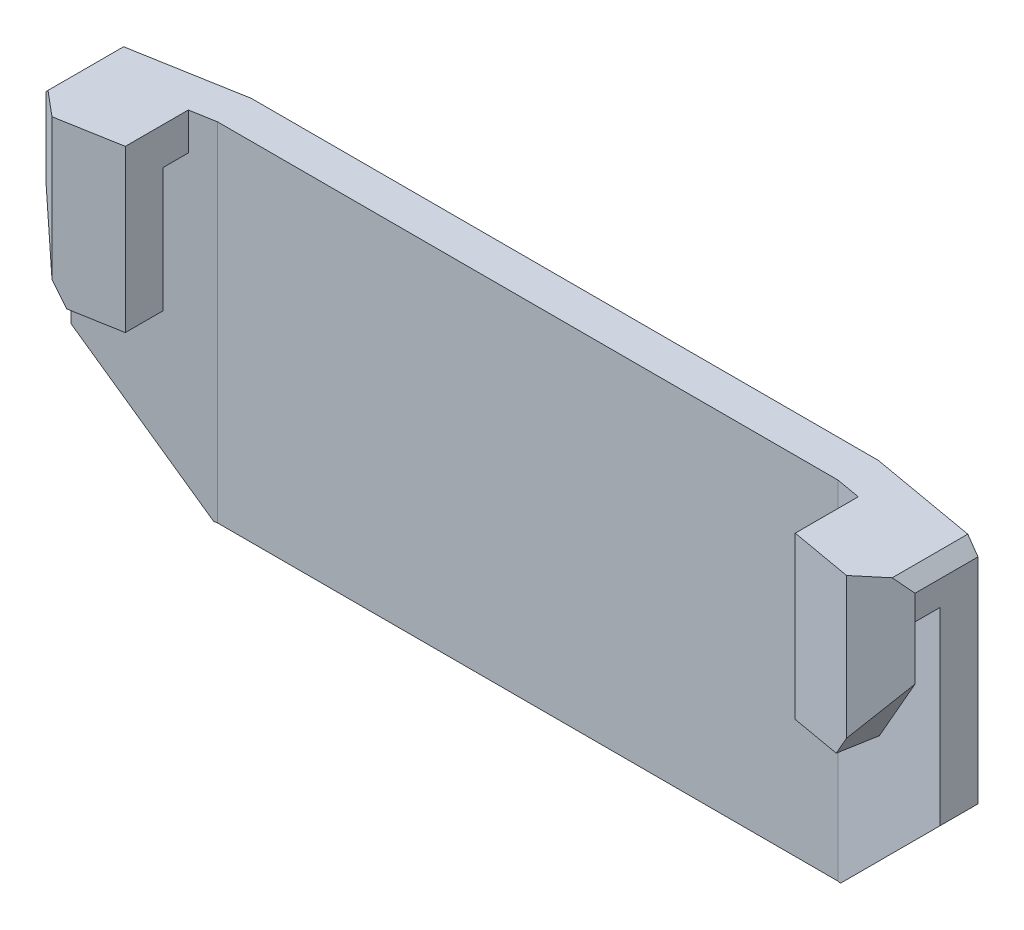
ISO-10303-21;
HEADER;
FILE_DESCRIPTION(('STEP AP214'),'2;1');
FILE_NAME('part.step','',(''),(''),'','','');
FILE_SCHEMA(('AUTOMOTIVE_DESIGN { 1 0 10303 214 1 1 1 1 }'));
ENDSEC;
DATA;
#1=APPLICATION_CONTEXT('core data for automotive mechanical design processes');
#2=APPLICATION_PROTOCOL_DEFINITION('international standard','automotive_design',2000,#1);
#3=PRODUCT_CONTEXT('',#1,'mechanical');
#4=PRODUCT('Part','Part','',(#3));
#5=PRODUCT_RELATED_PRODUCT_CATEGORY('part','',(#4));
#6=PRODUCT_DEFINITION_FORMATION('','',#4);
#7=PRODUCT_DEFINITION_CONTEXT('part definition',#1,'design');
#8=PRODUCT_DEFINITION('design','',#6,#7);
#9=PRODUCT_DEFINITION_SHAPE('','',#8);
#10=(LENGTH_UNIT() NAMED_UNIT(*) SI_UNIT(.MILLI.,.METRE.));
#11=(NAMED_UNIT(*) PLANE_ANGLE_UNIT() SI_UNIT($,.RADIAN.));
#12=(NAMED_UNIT(*) SI_UNIT($,.STERADIAN.) SOLID_ANGLE_UNIT());
#13=UNCERTAINTY_MEASURE_WITH_UNIT(LENGTH_MEASURE(1.E-05),#10,'distance_accuracy_value','');
#14=(GEOMETRIC_REPRESENTATION_CONTEXT(3) GLOBAL_UNCERTAINTY_ASSIGNED_CONTEXT((#13)) GLOBAL_UNIT_ASSIGNED_CONTEXT((#10,
#11,#12)) REPRESENTATION_CONTEXT('',''));
#15=CARTESIAN_POINT('',(0.,0.,0.));
#16=DIRECTION('',(0.,0.,1.));
#17=DIRECTION('',(1.,0.,0.));
#18=AXIS2_PLACEMENT_3D('',#15,#16,#17);
#19=CARTESIAN_POINT('',(0.,0.,0.));
#20=DIRECTION('',(0.,1.,0.));
#21=DIRECTION('',(0.,0.,1.));
#22=AXIS2_PLACEMENT_3D('',#19,#20,#21);
#23=PLANE('',#22);
#24=DIRECTION('',(0.,0.,-1.));
#25=VECTOR('',#24,1.);
#26=CARTESIAN_POINT('',(-26.9999999999979,0.,6.41436040896905));
#27=LINE('',#26,#25);
#28=CARTESIAN_POINT('',(-26.9999999999979,0.,4.38350718519735));
#29=VERTEX_POINT('',#28);
#30=CARTESIAN_POINT('',(-26.9999999999979,0.,2.35265396142685));
#31=VERTEX_POINT('',#30);
#32=EDGE_CURVE('E306',#29,#31,#27,.T.);
#33=ORIENTED_EDGE('',*,*,#32,.F.);
#34=DIRECTION('',(-0.984807753012105,0.,0.173648177667513));
#35=VECTOR('',#34,1.);
#36=CARTESIAN_POINT('',(-0.0645257415180483,0.,-0.365943664767394));
#37=LINE('',#36,#35);
#38=CARTESIAN_POINT('',(-35.0230548571713,0.,5.79818822422603));
#39=VERTEX_POINT('',#38);
#40=EDGE_CURVE('E240',#29,#39,#37,.T.);
#41=ORIENTED_EDGE('',*,*,#40,.T.);
#42=DIRECTION('',(0.,0.,1.));
#43=VECTOR('',#42,1.);
#44=CARTESIAN_POINT('',(-35.0230548571713,0.,1.73648177667474));
#45=LINE('',#44,#43);
#46=CARTESIAN_POINT('',(-35.0230548571713,0.,3.76733500045553));
#47=VERTEX_POINT('',#46);
#48=EDGE_CURVE('E302',#47,#39,#45,.T.);
#49=ORIENTED_EDGE('',*,*,#48,.F.);
#50=DIRECTION('',(-0.984807753012105,0.,0.173648177667513));
#51=VECTOR('',#50,1.);
#52=CARTESIAN_POINT('',(-26.9999999999979,0.,2.35265396142685));
#53=LINE('',#52,#51);
#54=EDGE_CURVE('E269',#31,#47,#53,.T.);
#55=ORIENTED_EDGE('',*,*,#54,.F.);
#56=EDGE_LOOP('',(#33,#41,#49,#55));
#57=FACE_BOUND('',#56,.T.);
#58=ADVANCED_FACE('F46',(#57),#23,.F.);
#59=DIRECTION('',(0.,0.,-1.));
#60=VECTOR('',#59,1.);
#61=CARTESIAN_POINT('',(35.0230548571713,0.,1.73648177667474));
#62=LINE('',#61,#60);
#63=CARTESIAN_POINT('',(35.0230548571714,0.,5.79818822422579));
#64=VERTEX_POINT('',#63);
#65=CARTESIAN_POINT('',(35.0230548571713,0.,3.76733500045552));
#66=VERTEX_POINT('',#65);
#67=EDGE_CURVE('E280',#64,#66,#62,.T.);
#68=ORIENTED_EDGE('',*,*,#67,.F.);
#69=DIRECTION('',(-0.984807753012107,0.,-0.173648177667506));
#70=VECTOR('',#69,1.);
#71=CARTESIAN_POINT('',(0.0645257415180458,0.,-0.365943664767394));
#72=LINE('',#71,#70);
#73=CARTESIAN_POINT('',(26.9999999999979,0.,4.38350718519716));
#74=VERTEX_POINT('',#73);
#75=EDGE_CURVE('E478',#64,#74,#72,.T.);
#76=ORIENTED_EDGE('',*,*,#75,.T.);
#77=DIRECTION('',(0.,0.,1.));
#78=VECTOR('',#77,1.);
#79=CARTESIAN_POINT('',(26.9999999999979,0.,6.41436040896905));
#80=LINE('',#79,#78);
#81=CARTESIAN_POINT('',(26.9999999999979,0.,2.35265396142685));
#82=VERTEX_POINT('',#81);
#83=EDGE_CURVE('E285',#82,#74,#80,.T.);
#84=ORIENTED_EDGE('',*,*,#83,.F.);
#85=DIRECTION('',(-0.984807753012106,0.,-0.173648177667512));
#86=VECTOR('',#85,1.);
#87=CARTESIAN_POINT('',(24.9999999999987,0.,2.00000000000886));
#88=LINE('',#87,#86);
#89=EDGE_CURVE('E254',#66,#82,#88,.T.);
#90=ORIENTED_EDGE('',*,*,#89,.F.);
#91=EDGE_LOOP('',(#68,#76,#84,#90));
#92=FACE_BOUND('',#91,.T.);
#93=ADVANCED_FACE('F544',(#92),#23,.F.);
#94=CARTESIAN_POINT('',(35.0230548571713,3.,1.73648177667474));
#95=DIRECTION('',(-1.,0.,0.));
#96=DIRECTION('',(0.,0.,1.));
#97=AXIS2_PLACEMENT_3D('',#94,#95,#96);
#98=PLANE('',#97);
#99=DIRECTION('',(0.,1.,0.));
#100=VECTOR('',#99,1.);
#101=CARTESIAN_POINT('',(35.0230548571713,-95.0995422141101,0.721055164788883));
#102=LINE('',#101,#100);
#103=CARTESIAN_POINT('',(35.0230548571713,-15.2394111334073,0.721055164788883));
#104=VERTEX_POINT('',#103);
#105=CARTESIAN_POINT('',(35.0230548571713,1.99999999999997,0.721055164788883));
#106=VERTEX_POINT('',#105);
#107=EDGE_CURVE('E369',#104,#106,#102,.T.);
#108=ORIENTED_EDGE('',*,*,#107,.T.);
#109=DIRECTION('',(0.,0.,1.));
#110=VECTOR('',#109,1.);
#111=CARTESIAN_POINT('',(35.0230548571713,1.99999999999998,5.79818822422579));
#112=LINE('',#111,#110);
#113=CARTESIAN_POINT('',(35.0230548571714,1.99999999999998,5.79818822422579));
#114=VERTEX_POINT('',#113);
#115=EDGE_CURVE('E56',#106,#114,#112,.T.);
#116=ORIENTED_EDGE('',*,*,#115,.T.);
#117=DIRECTION('',(0.,-1.,0.));
#118=VECTOR('',#117,1.);
#119=CARTESIAN_POINT('',(35.0230548571714,7.27549071302264,5.79818822422579));
#120=LINE('',#119,#118);
#121=EDGE_CURVE('E387',#114,#64,#120,.T.);
#122=ORIENTED_EDGE('',*,*,#121,.T.);
#123=ORIENTED_EDGE('',*,*,#67,.T.);
#124=DIRECTION('',(0.,1.,0.));
#125=VECTOR('',#124,1.);
#126=CARTESIAN_POINT('',(35.0230548571713,-25.,3.76733500045552));
#127=LINE('',#126,#125);
#128=CARTESIAN_POINT('',(35.0230548571713,-15.2394111334073,3.76733500045552));
#129=VERTEX_POINT('',#128);
#130=EDGE_CURVE('E277',#129,#66,#127,.T.);
#131=ORIENTED_EDGE('',*,*,#130,.F.);
#132=DIRECTION('',(0.,0.,-1.));
#133=VECTOR('',#132,1.);
#134=CARTESIAN_POINT('',(35.0230548571713,-15.2394111334073,3.76733500045552));
#135=LINE('',#134,#133);
#136=EDGE_CURVE('E416',#129,#104,#135,.T.);
#137=ORIENTED_EDGE('',*,*,#136,.T.);
#138=EDGE_LOOP('',(#108,#116,#122,#123,#131,#137));
#139=FACE_BOUND('',#138,.T.);
#140=ADVANCED_FACE('F547',(#139),#98,.F.);
#141=CARTESIAN_POINT('',(-35.0230548571713,3.,1.73648177667474));
#142=DIRECTION('',(1.,0.,0.));
#143=DIRECTION('',(0.,0.,-1.));
#144=AXIS2_PLACEMENT_3D('',#141,#142,#143);
#145=PLANE('',#144);
#146=DIRECTION('',(0.,-1.,0.));
#147=VECTOR('',#146,1.);
#148=CARTESIAN_POINT('',(-35.0230548571713,7.27549071302266,5.79818822422603));
#149=LINE('',#148,#147);
#150=CARTESIAN_POINT('',(-35.0230548571713,1.99999999999998,5.79818822422603));
#151=VERTEX_POINT('',#150);
#152=EDGE_CURVE('E230',#151,#39,#149,.T.);
#153=ORIENTED_EDGE('',*,*,#152,.F.);
#154=DIRECTION('',(0.,0.,-1.));
#155=VECTOR('',#154,1.);
#156=CARTESIAN_POINT('',(-35.0230548571713,1.99999999999998,0.721055164788891));
#157=LINE('',#156,#155);
#158=CARTESIAN_POINT('',(-35.0230548571713,1.99999999999997,0.721055164788891));
#159=VERTEX_POINT('',#158);
#160=EDGE_CURVE('E345',#151,#159,#157,.T.);
#161=ORIENTED_EDGE('',*,*,#160,.T.);
#162=DIRECTION('',(0.,1.,0.));
#163=VECTOR('',#162,1.);
#164=CARTESIAN_POINT('',(-35.0230548571713,-95.0995422141101,0.721055164788891));
#165=LINE('',#164,#163);
#166=CARTESIAN_POINT('',(-35.0230548571713,-15.2394111334074,0.721055164788891));
#167=VERTEX_POINT('',#166);
#168=EDGE_CURVE('E362',#167,#159,#165,.T.);
#169=ORIENTED_EDGE('',*,*,#168,.F.);
#170=DIRECTION('',(0.,0.,-1.));
#171=VECTOR('',#170,1.);
#172=CARTESIAN_POINT('',(-35.0230548571713,-15.2394111334074,3.76733500045552));
#173=LINE('',#172,#171);
#174=CARTESIAN_POINT('',(-35.0230548571713,-15.2394111334074,3.76733500045552));
#175=VERTEX_POINT('',#174);
#176=EDGE_CURVE('E420',#175,#167,#173,.T.);
#177=ORIENTED_EDGE('',*,*,#176,.F.);
#178=DIRECTION('',(0.,1.,0.));
#179=VECTOR('',#178,1.);
#180=CARTESIAN_POINT('',(-35.0230548571713,-25.,3.76733500045553));
#181=LINE('',#180,#179);
#182=EDGE_CURVE('E266',#175,#47,#181,.T.);
#183=ORIENTED_EDGE('',*,*,#182,.T.);
#184=ORIENTED_EDGE('',*,*,#48,.T.);
#185=EDGE_LOOP('',(#153,#161,#169,#177,#183,#184));
#186=FACE_BOUND('',#185,.T.);
#187=ADVANCED_FACE('F374',(#186),#145,.F.);
#188=CARTESIAN_POINT('',(-26.9999999999979,3.,6.41436040896905));
#189=DIRECTION('',(-1.,0.,0.));
#190=DIRECTION('',(0.,0.,1.));
#191=AXIS2_PLACEMENT_3D('',#188,#189,#190);
#192=PLANE('',#191);
#193=DIRECTION('',(0.,-1.,0.));
#194=VECTOR('',#193,1.);
#195=CARTESIAN_POINT('',(-26.9999999999979,12.1798464674904,4.38350718519735));
#196=LINE('',#195,#194);
#197=CARTESIAN_POINT('',(-26.9999999999979,-10.,4.38350718519735));
#198=VERTEX_POINT('',#197);
#199=EDGE_CURVE('E242',#29,#198,#196,.T.);
#200=ORIENTED_EDGE('',*,*,#199,.F.);
#201=ORIENTED_EDGE('',*,*,#32,.T.);
#202=DIRECTION('',(0.,-1.,0.));
#203=VECTOR('',#202,1.);
#204=CARTESIAN_POINT('',(-26.9999999999979,3.,2.35265396142685));
#205=LINE('',#204,#203);
#206=CARTESIAN_POINT('',(-26.9999999999979,3.,2.35265396142685));
#207=VERTEX_POINT('',#206);
#208=EDGE_CURVE('E274',#207,#31,#205,.T.);
#209=ORIENTED_EDGE('',*,*,#208,.F.);
#210=DIRECTION('',(0.,0.,-1.));
#211=VECTOR('',#210,1.);
#212=CARTESIAN_POINT('',(-26.9999999999979,3.,6.41436040896905));
#213=LINE('',#212,#211);
#214=CARTESIAN_POINT('',(-26.9999999999979,3.,7.4297870208549));
#215=VERTEX_POINT('',#214);
#216=EDGE_CURVE('E281',#215,#207,#213,.T.);
#217=ORIENTED_EDGE('',*,*,#216,.F.);
#218=DIRECTION('',(0.,-1.,0.));
#219=VECTOR('',#218,1.);
#220=CARTESIAN_POINT('',(-26.9999999999979,12.1798464674904,7.4297870208549));
#221=LINE('',#220,#219);
#222=CARTESIAN_POINT('',(-26.9999999999979,-10.,7.4297870208549));
#223=VERTEX_POINT('',#222);
#224=EDGE_CURVE('E234',#215,#223,#221,.T.);
#225=ORIENTED_EDGE('',*,*,#224,.T.);
#226=DIRECTION('',(0.,0.,1.));
#227=VECTOR('',#226,1.);
#228=CARTESIAN_POINT('',(-26.9999999999979,-10.,4.38350718519735));
#229=LINE('',#228,#227);
#230=EDGE_CURVE('E483',#198,#223,#229,.T.);
#231=ORIENTED_EDGE('',*,*,#230,.F.);
#232=EDGE_LOOP('',(#200,#201,#209,#217,#225,#231));
#233=FACE_BOUND('',#232,.T.);
#234=ADVANCED_FACE('F500',(#233),#192,.F.);
#235=CARTESIAN_POINT('',(-26.9999999999979,3.,2.35265396142685));
#236=DIRECTION('',(-0.173648177667513,0.,-0.984807753012105));
#237=DIRECTION('',(-0.984807753012105,0.,0.173648177667513));
#238=AXIS2_PLACEMENT_3D('',#235,#236,#237);
#239=PLANE('',#238);
#240=ORIENTED_EDGE('',*,*,#182,.F.);
#241=DIRECTION('',(0.701673843159825,-0.701673843159828,-0.123724030206905));
#242=VECTOR('',#241,1.);
#243=CARTESIAN_POINT('',(-39.9302248649527,-10.332241125626,4.63260147175375));
#244=LINE('',#243,#242);
#245=CARTESIAN_POINT('',(-25.2624659905788,-25.,2.04627983566665));
#246=VERTEX_POINT('',#245);
#247=EDGE_CURVE('E415',#175,#246,#244,.T.);
#248=ORIENTED_EDGE('',*,*,#247,.T.);
#249=DIRECTION('',(-0.984807753012105,0.,0.173648177667513));
#250=VECTOR('',#249,1.);
#251=CARTESIAN_POINT('',(-24.9999999999987,-25.,2.00000000000885));
#252=LINE('',#251,#250);
#253=CARTESIAN_POINT('',(-24.9999999999987,-25.,2.00000000000885));
#254=VERTEX_POINT('',#253);
#255=EDGE_CURVE('E262',#254,#246,#252,.T.);
#256=ORIENTED_EDGE('',*,*,#255,.F.);
#257=DIRECTION('',(0.,-1.,0.));
#258=VECTOR('',#257,1.);
#259=CARTESIAN_POINT('',(-24.9999999999987,3.,2.00000000000885));
#260=LINE('',#259,#258);
#261=CARTESIAN_POINT('',(-24.9999999999987,3.,2.00000000000885));
#262=VERTEX_POINT('',#261);
#263=EDGE_CURVE('E319',#262,#254,#260,.T.);
#264=ORIENTED_EDGE('',*,*,#263,.F.);
#265=DIRECTION('',(0.984807753012105,0.,-0.173648177667513));
#266=VECTOR('',#265,1.);
#267=CARTESIAN_POINT('',(-26.9999999999979,3.,2.35265396142685));
#268=LINE('',#267,#266);
#269=EDGE_CURVE('E284',#207,#262,#268,.T.);
#270=ORIENTED_EDGE('',*,*,#269,.F.);
#271=ORIENTED_EDGE('',*,*,#208,.T.);
#272=ORIENTED_EDGE('',*,*,#54,.T.);
#273=EDGE_LOOP('',(#240,#248,#256,#264,#270,#271,#272));
#274=FACE_BOUND('',#273,.T.);
#275=ADVANCED_FACE('F509',(#274),#239,.F.);
#276=CARTESIAN_POINT('',(-24.9999999999987,3.,2.00000000000885));
#277=DIRECTION('',(0.,0.,-1.));
#278=DIRECTION('',(-1.,0.,0.));
#279=AXIS2_PLACEMENT_3D('',#276,#277,#278);
#280=PLANE('',#279);
#281=ORIENTED_EDGE('',*,*,#263,.T.);
#282=DIRECTION('',(-1.,0.,0.));
#283=VECTOR('',#282,1.);
#284=CARTESIAN_POINT('',(-24.9999999999987,-25.,2.00000000000885));
#285=LINE('',#284,#283);
#286=CARTESIAN_POINT('',(24.9999999999987,-25.,2.00000000000886));
#287=VERTEX_POINT('',#286);
#288=EDGE_CURVE('E258',#287,#254,#285,.T.);
#289=ORIENTED_EDGE('',*,*,#288,.F.);
#290=DIRECTION('',(0.,-1.,0.));
#291=VECTOR('',#290,1.);
#292=CARTESIAN_POINT('',(24.9999999999987,3.,2.00000000000886));
#293=LINE('',#292,#291);
#294=CARTESIAN_POINT('',(24.9999999999987,3.,2.00000000000886));
#295=VERTEX_POINT('',#294);
#296=EDGE_CURVE('E315',#295,#287,#293,.T.);
#297=ORIENTED_EDGE('',*,*,#296,.F.);
#298=DIRECTION('',(1.,0.,0.));
#299=VECTOR('',#298,1.);
#300=CARTESIAN_POINT('',(-24.9999999999987,3.,2.00000000000885));
#301=LINE('',#300,#299);
#302=EDGE_CURVE('E288',#262,#295,#301,.T.);
#303=ORIENTED_EDGE('',*,*,#302,.F.);
#304=EDGE_LOOP('',(#281,#289,#297,#303));
#305=FACE_BOUND('',#304,.T.);
#306=ADVANCED_FACE('F512',(#305),#280,.F.);
#307=CARTESIAN_POINT('',(26.9999999999979,3.,2.35265396142685));
#308=DIRECTION('',(0.173648177667512,0.,-0.984807753012105));
#309=DIRECTION('',(-0.984807753012106,0.,-0.173648177667512));
#310=AXIS2_PLACEMENT_3D('',#307,#308,#309);
#311=PLANE('',#310);
#312=DIRECTION('',(-0.984807753012105,0.,-0.173648177667512));
#313=VECTOR('',#312,1.);
#314=CARTESIAN_POINT('',(26.9999999999979,-25.,2.35265396142685));
#315=LINE('',#314,#313);
#316=CARTESIAN_POINT('',(25.2624659905787,-25.,2.04627983566664));
#317=VERTEX_POINT('',#316);
#318=EDGE_CURVE('E255',#317,#287,#315,.T.);
#319=ORIENTED_EDGE('',*,*,#318,.F.);
#320=DIRECTION('',(0.701673843159825,0.701673843159827,0.123724030206904));
#321=VECTOR('',#320,1.);
#322=CARTESIAN_POINT('',(39.9302248649527,-10.3322411256259,4.63260147175374));
#323=LINE('',#322,#321);
#324=EDGE_CURVE('E429',#317,#129,#323,.T.);
#325=ORIENTED_EDGE('',*,*,#324,.T.);
#326=ORIENTED_EDGE('',*,*,#130,.T.);
#327=ORIENTED_EDGE('',*,*,#89,.T.);
#328=DIRECTION('',(0.,-1.,0.));
#329=VECTOR('',#328,1.);
#330=CARTESIAN_POINT('',(26.9999999999979,3.,2.35265396142685));
#331=LINE('',#330,#329);
#332=CARTESIAN_POINT('',(26.9999999999979,3.,2.35265396142685));
#333=VERTEX_POINT('',#332);
#334=EDGE_CURVE('E298',#333,#82,#331,.T.);
#335=ORIENTED_EDGE('',*,*,#334,.F.);
#336=DIRECTION('',(0.984807753012106,0.,0.173648177667512));
#337=VECTOR('',#336,1.);
#338=CARTESIAN_POINT('',(26.9999999999979,3.,2.35265396142685));
#339=LINE('',#338,#337);
#340=EDGE_CURVE('E291',#295,#333,#339,.T.);
#341=ORIENTED_EDGE('',*,*,#340,.F.);
#342=ORIENTED_EDGE('',*,*,#296,.T.);
#343=EDGE_LOOP('',(#319,#325,#326,#327,#335,#341,#342));
#344=FACE_BOUND('',#343,.T.);
#345=ADVANCED_FACE('F517',(#344),#311,.F.);
#346=CARTESIAN_POINT('',(26.9999999999979,3.,6.41436040896905));
#347=DIRECTION('',(1.,0.,0.));
#348=DIRECTION('',(0.,0.,-1.));
#349=AXIS2_PLACEMENT_3D('',#346,#347,#348);
#350=PLANE('',#349);
#351=ORIENTED_EDGE('',*,*,#83,.T.);
#352=DIRECTION('',(0.,-1.,0.));
#353=VECTOR('',#352,1.);
#354=CARTESIAN_POINT('',(26.9999999999979,12.1798464674904,4.38350718519716));
#355=LINE('',#354,#353);
#356=CARTESIAN_POINT('',(26.9999999999979,-10.,4.38350718519716));
#357=VERTEX_POINT('',#356);
#358=EDGE_CURVE('E446',#74,#357,#355,.T.);
#359=ORIENTED_EDGE('',*,*,#358,.T.);
#360=DIRECTION('',(0.,0.,-1.));
#361=VECTOR('',#360,1.);
#362=CARTESIAN_POINT('',(26.9999999999979,-10.,4.38350718519716));
#363=LINE('',#362,#361);
#364=CARTESIAN_POINT('',(26.9999999999979,-10.,7.42978702085472));
#365=VERTEX_POINT('',#364);
#366=EDGE_CURVE('E474',#365,#357,#363,.T.);
#367=ORIENTED_EDGE('',*,*,#366,.F.);
#368=DIRECTION('',(0.,-1.,0.));
#369=VECTOR('',#368,1.);
#370=CARTESIAN_POINT('',(26.9999999999979,12.1798464674904,7.42978702085472));
#371=LINE('',#370,#369);
#372=CARTESIAN_POINT('',(26.9999999999979,3.,7.42978702085472));
#373=VERTEX_POINT('',#372);
#374=EDGE_CURVE('E456',#373,#365,#371,.T.);
#375=ORIENTED_EDGE('',*,*,#374,.F.);
#376=DIRECTION('',(0.,0.,1.));
#377=VECTOR('',#376,1.);
#378=CARTESIAN_POINT('',(26.9999999999979,3.,6.41436040896905));
#379=LINE('',#378,#377);
#380=EDGE_CURVE('E294',#333,#373,#379,.T.);
#381=ORIENTED_EDGE('',*,*,#380,.F.);
#382=ORIENTED_EDGE('',*,*,#334,.T.);
#383=EDGE_LOOP('',(#351,#359,#367,#375,#381,#382));
#384=FACE_BOUND('',#383,.T.);
#385=ADVANCED_FACE('F523',(#384),#350,.F.);
#386=CARTESIAN_POINT('',(0.,3.,0.));
#387=DIRECTION('',(0.,1.,0.));
#388=DIRECTION('',(0.,0.,1.));
#389=AXIS2_PLACEMENT_3D('',#386,#387,#388);
#390=PLANE('',#389);
#391=DIRECTION('',(-0.984807753012105,0.,0.173648177667513));
#392=VECTOR('',#391,1.);
#393=CARTESIAN_POINT('',(-35.0230548571713,3.,0.721055164788891));
#394=LINE('',#393,#392);
#395=CARTESIAN_POINT('',(-25.2624659905788,3.,-0.999999999999994));
#396=VERTEX_POINT('',#395);
#397=CARTESIAN_POINT('',(-34.0230548571713,3.,0.544728184079813));
#398=VERTEX_POINT('',#397);
#399=EDGE_CURVE('E359',#396,#398,#394,.T.);
#400=ORIENTED_EDGE('',*,*,#399,.T.);
#401=DIRECTION('',(0.,0.,1.));
#402=VECTOR('',#401,1.);
#403=CARTESIAN_POINT('',(-34.0230548571713,3.,5.79818822422603));
#404=LINE('',#403,#402);
#405=CARTESIAN_POINT('',(-34.0230548571713,3.,6.63728785540231));
#406=VERTEX_POINT('',#405);
#407=EDGE_CURVE('E217',#398,#406,#404,.T.);
#408=ORIENTED_EDGE('',*,*,#407,.T.);
#409=DIRECTION('',(0.766044443119361,0.,0.642787609686083));
#410=VECTOR('',#409,1.);
#411=CARTESIAN_POINT('',(-35.0230548571713,3.,5.79818822422603));
#412=LINE('',#411,#410);
#413=CARTESIAN_POINT('',(-32.0230548571698,3.,8.31548711775609));
#414=VERTEX_POINT('',#413);
#415=EDGE_CURVE('E209',#406,#414,#412,.T.);
#416=ORIENTED_EDGE('',*,*,#415,.T.);
#417=DIRECTION('',(-0.984807753012105,0.,0.173648177667513));
#418=VECTOR('',#417,1.);
#419=CARTESIAN_POINT('',(-26.9999999999979,3.,7.4297870208549));
#420=LINE('',#419,#418);
#421=EDGE_CURVE('E214',#215,#414,#420,.T.);
#422=ORIENTED_EDGE('',*,*,#421,.F.);
#423=ORIENTED_EDGE('',*,*,#216,.T.);
#424=ORIENTED_EDGE('',*,*,#269,.T.);
#425=ORIENTED_EDGE('',*,*,#302,.T.);
#426=ORIENTED_EDGE('',*,*,#340,.T.);
#427=ORIENTED_EDGE('',*,*,#380,.T.);
#428=DIRECTION('',(-0.984807753012107,0.,-0.173648177667506));
#429=VECTOR('',#428,1.);
#430=CARTESIAN_POINT('',(26.9999999999979,3.,7.42978702085472));
#431=LINE('',#430,#429);
#432=CARTESIAN_POINT('',(32.0230548571699,3.,8.31548711775587));
#433=VERTEX_POINT('',#432);
#434=EDGE_CURVE('E462',#433,#373,#431,.T.);
#435=ORIENTED_EDGE('',*,*,#434,.F.);
#436=DIRECTION('',(0.766044443119353,0.,-0.642787609686092));
#437=VECTOR('',#436,1.);
#438=CARTESIAN_POINT('',(35.0230548571714,3.,5.79818822422579));
#439=LINE('',#438,#437);
#440=CARTESIAN_POINT('',(34.0230548571713,3.,6.63728785540212));
#441=VERTEX_POINT('',#440);
#442=EDGE_CURVE('E381',#433,#441,#439,.T.);
#443=ORIENTED_EDGE('',*,*,#442,.T.);
#444=DIRECTION('',(0.,0.,-1.));
#445=VECTOR('',#444,1.);
#446=CARTESIAN_POINT('',(34.0230548571713,3.,0.721055164788883));
#447=LINE('',#446,#445);
#448=CARTESIAN_POINT('',(34.0230548571713,3.,0.544728184079807));
#449=VERTEX_POINT('',#448);
#450=EDGE_CURVE('E336',#441,#449,#447,.T.);
#451=ORIENTED_EDGE('',*,*,#450,.T.);
#452=DIRECTION('',(-0.984807753012106,0.,-0.173648177667512));
#453=VECTOR('',#452,1.);
#454=CARTESIAN_POINT('',(25.2624659905787,3.,-0.999999999999994));
#455=LINE('',#454,#453);
#456=CARTESIAN_POINT('',(25.2624659905787,3.,-0.999999999999994));
#457=VERTEX_POINT('',#456);
#458=EDGE_CURVE('E432',#449,#457,#455,.T.);
#459=ORIENTED_EDGE('',*,*,#458,.T.);
#460=DIRECTION('',(-1.,0.,0.));
#461=VECTOR('',#460,1.);
#462=CARTESIAN_POINT('',(-25.2624659905788,3.,-0.999999999999994));
#463=LINE('',#462,#461);
#464=EDGE_CURVE('E367',#457,#396,#463,.T.);
#465=ORIENTED_EDGE('',*,*,#464,.T.);
#466=EDGE_LOOP('',(#400,#408,#416,#422,#423,#424,#425,#426,#427,#435,#443,#451,#459,#465));
#467=FACE_BOUND('',#466,.T.);
#468=ADVANCED_FACE('F212',(#467),#390,.T.);
#469=CARTESIAN_POINT('',(0.,-25.,0.));
#470=DIRECTION('',(0.,-1.,0.));
#471=DIRECTION('',(0.,0.,-1.));
#472=AXIS2_PLACEMENT_3D('',#469,#470,#471);
#473=PLANE('',#472);
#474=DIRECTION('',(0.,0.,-1.));
#475=VECTOR('',#474,1.);
#476=CARTESIAN_POINT('',(25.2624659905787,-25.,3.76733500045552));
#477=LINE('',#476,#475);
#478=CARTESIAN_POINT('',(25.2624659905787,-25.,-0.999999999999994));
#479=VERTEX_POINT('',#478);
#480=EDGE_CURVE('E412',#317,#479,#477,.T.);
#481=ORIENTED_EDGE('',*,*,#480,.F.);
#482=ORIENTED_EDGE('',*,*,#318,.T.);
#483=ORIENTED_EDGE('',*,*,#288,.T.);
#484=ORIENTED_EDGE('',*,*,#255,.T.);
#485=DIRECTION('',(0.,0.,-1.));
#486=VECTOR('',#485,1.);
#487=CARTESIAN_POINT('',(-25.2624659905788,-25.,3.76733500045552));
#488=LINE('',#487,#486);
#489=CARTESIAN_POINT('',(-25.2624659905788,-25.,-0.999999999999994));
#490=VERTEX_POINT('',#489);
#491=EDGE_CURVE('E409',#246,#490,#488,.T.);
#492=ORIENTED_EDGE('',*,*,#491,.T.);
#493=DIRECTION('',(-1.,0.,0.));
#494=VECTOR('',#493,1.);
#495=CARTESIAN_POINT('',(-25.2624659905788,-25.,-0.999999999999994));
#496=LINE('',#495,#494);
#497=EDGE_CURVE('E438',#479,#490,#496,.T.);
#498=ORIENTED_EDGE('',*,*,#497,.F.);
#499=EDGE_LOOP('',(#481,#482,#483,#484,#492,#498));
#500=FACE_BOUND('',#499,.T.);
#501=ADVANCED_FACE('F554',(#500),#473,.T.);
#502=CARTESIAN_POINT('',(-35.0230548571713,12.1798464674904,5.79818822422603));
#503=DIRECTION('',(-0.173648177667513,0.,-0.984807753012105));
#504=DIRECTION('',(-0.984807753012105,0.,0.173648177667513));
#505=AXIS2_PLACEMENT_3D('',#502,#503,#504);
#506=PLANE('',#505);
#507=DIRECTION('',(-0.522954052704811,0.847358369871299,0.0922109091630136));
#508=VECTOR('',#507,1.);
#509=CARTESIAN_POINT('',(-35.5439993901739,-3.5,5.89004480084727));
#510=LINE('',#509,#508);
#511=CARTESIAN_POINT('',(-31.5324719615871,-10.,5.18270428133293));
#512=VERTEX_POINT('',#511);
#513=CARTESIAN_POINT('',(-35.0230548571713,-4.34410228392966,5.79818822422603));
#514=VERTEX_POINT('',#513);
#515=EDGE_CURVE('E405',#512,#514,#510,.T.);
#516=ORIENTED_EDGE('',*,*,#515,.T.);
#517=DIRECTION('',(0.,-1.,0.));
#518=VECTOR('',#517,1.);
#519=CARTESIAN_POINT('',(-35.0230548571713,12.1798464674904,5.79818822422603));
#520=LINE('',#519,#518);
#521=EDGE_CURVE('E236',#39,#514,#520,.T.);
#522=ORIENTED_EDGE('',*,*,#521,.F.);
#523=ORIENTED_EDGE('',*,*,#40,.F.);
#524=ORIENTED_EDGE('',*,*,#199,.T.);
#525=DIRECTION('',(0.984807753012105,0.,-0.173648177667513));
#526=VECTOR('',#525,1.);
#527=CARTESIAN_POINT('',(-35.0230548571713,-10.,5.79818822422603));
#528=LINE('',#527,#526);
#529=EDGE_CURVE('E481',#512,#198,#528,.T.);
#530=ORIENTED_EDGE('',*,*,#529,.F.);
#531=EDGE_LOOP('',(#516,#522,#523,#524,#530));
#532=FACE_BOUND('',#531,.T.);
#533=ADVANCED_FACE('F496',(#532),#506,.T.);
#534=CARTESIAN_POINT('',(-26.9999999999979,12.1798464674904,7.4297870208549));
#535=DIRECTION('',(0.173648177667513,0.,0.984807753012105));
#536=DIRECTION('',(0.984807753012105,0.,-0.173648177667513));
#537=AXIS2_PLACEMENT_3D('',#534,#535,#536);
#538=PLANE('',#537);
#539=DIRECTION('',(0.,-1.,0.));
#540=VECTOR('',#539,1.);
#541=CARTESIAN_POINT('',(-32.0230548571698,7.27549071302266,8.31548711775609));
#542=LINE('',#541,#540);
#543=CARTESIAN_POINT('',(-32.0230548571698,-8.36099131743434,8.31548711775609));
#544=VERTEX_POINT('',#543);
#545=EDGE_CURVE('E220',#414,#544,#542,.T.);
#546=ORIENTED_EDGE('',*,*,#545,.T.);
#547=DIRECTION('',(-0.522954052704811,0.847358369871299,0.0922109091630137));
#548=VECTOR('',#547,1.);
#549=CARTESIAN_POINT('',(-35.0230548571714,-3.5,8.84446805988359));
#550=LINE('',#549,#548);
#551=CARTESIAN_POINT('',(-31.0115274285846,-10.,8.13712754036925));
#552=VERTEX_POINT('',#551);
#553=EDGE_CURVE('E401',#552,#544,#550,.T.);
#554=ORIENTED_EDGE('',*,*,#553,.F.);
#555=DIRECTION('',(-0.984807753012105,0.,0.173648177667513));
#556=VECTOR('',#555,1.);
#557=CARTESIAN_POINT('',(-26.9999999999979,-10.,7.4297870208549));
#558=LINE('',#557,#556);
#559=EDGE_CURVE('E245',#223,#552,#558,.T.);
#560=ORIENTED_EDGE('',*,*,#559,.F.);
#561=ORIENTED_EDGE('',*,*,#224,.F.);
#562=ORIENTED_EDGE('',*,*,#421,.T.);
#563=EDGE_LOOP('',(#546,#554,#560,#561,#562));
#564=FACE_BOUND('',#563,.T.);
#565=ADVANCED_FACE('F232',(#564),#538,.T.);
#566=CARTESIAN_POINT('',(0.,-10.,0.));
#567=DIRECTION('',(0.,-1.,0.));
#568=DIRECTION('',(0.,0.,-1.));
#569=AXIS2_PLACEMENT_3D('',#566,#567,#568);
#570=PLANE('',#569);
#571=DIRECTION('',(0.173648177667513,0.,0.984807753012105));
#572=VECTOR('',#571,1.);
#573=CARTESIAN_POINT('',(-32.8645094972644,-10.,-2.37165597777556));
#574=LINE('',#573,#572);
#575=EDGE_CURVE('E404',#512,#552,#574,.T.);
#576=ORIENTED_EDGE('',*,*,#575,.F.);
#577=ORIENTED_EDGE('',*,*,#529,.T.);
#578=ORIENTED_EDGE('',*,*,#230,.T.);
#579=ORIENTED_EDGE('',*,*,#559,.T.);
#580=EDGE_LOOP('',(#576,#577,#578,#579));
#581=FACE_BOUND('',#580,.T.);
#582=ADVANCED_FACE('F491',(#581),#570,.T.);
#583=CARTESIAN_POINT('',(35.0230548571714,12.1798464674904,5.79818822422579));
#584=DIRECTION('',(0.173648177667506,0.,-0.984807753012107));
#585=DIRECTION('',(-0.984807753012107,0.,-0.173648177667506));
#586=AXIS2_PLACEMENT_3D('',#583,#584,#585);
#587=PLANE('',#586);
#588=DIRECTION('',(-0.522954052704811,-0.847358369871299,-0.0922109091630098));
#589=VECTOR('',#588,1.);
#590=CARTESIAN_POINT('',(35.5439993901739,-3.5,5.89004480084702));
#591=LINE('',#590,#589);
#592=CARTESIAN_POINT('',(35.0230548571714,-4.34410228392966,5.79818822422579));
#593=VERTEX_POINT('',#592);
#594=CARTESIAN_POINT('',(31.5324719615872,-10.,5.18270428133271));
#595=VERTEX_POINT('',#594);
#596=EDGE_CURVE('E393',#593,#595,#591,.T.);
#597=ORIENTED_EDGE('',*,*,#596,.T.);
#598=DIRECTION('',(0.984807753012107,0.,0.173648177667506));
#599=VECTOR('',#598,1.);
#600=CARTESIAN_POINT('',(35.0230548571714,-10.,5.79818822422579));
#601=LINE('',#600,#599);
#602=EDGE_CURVE('E470',#357,#595,#601,.T.);
#603=ORIENTED_EDGE('',*,*,#602,.F.);
#604=ORIENTED_EDGE('',*,*,#358,.F.);
#605=ORIENTED_EDGE('',*,*,#75,.F.);
#606=DIRECTION('',(0.,-1.,0.));
#607=VECTOR('',#606,1.);
#608=CARTESIAN_POINT('',(35.0230548571714,12.1798464674904,5.79818822422579));
#609=LINE('',#608,#607);
#610=EDGE_CURVE('E457',#64,#593,#609,.T.);
#611=ORIENTED_EDGE('',*,*,#610,.T.);
#612=EDGE_LOOP('',(#597,#603,#604,#605,#611));
#613=FACE_BOUND('',#612,.T.);
#614=ADVANCED_FACE('F538',(#613),#587,.T.);
#615=CARTESIAN_POINT('',(26.9999999999979,12.1798464674904,7.42978702085472));
#616=DIRECTION('',(-0.173648177667506,0.,0.984807753012107));
#617=DIRECTION('',(0.984807753012107,0.,0.173648177667506));
#618=AXIS2_PLACEMENT_3D('',#615,#616,#617);
#619=PLANE('',#618);
#620=DIRECTION('',(0.,-1.,0.));
#621=VECTOR('',#620,1.);
#622=CARTESIAN_POINT('',(32.0230548571699,7.27549071302264,8.31548711775587));
#623=LINE('',#622,#621);
#624=CARTESIAN_POINT('',(32.0230548571699,-8.3609913174343,8.31548711775588));
#625=VERTEX_POINT('',#624);
#626=EDGE_CURVE('E378',#433,#625,#623,.T.);
#627=ORIENTED_EDGE('',*,*,#626,.F.);
#628=ORIENTED_EDGE('',*,*,#434,.T.);
#629=ORIENTED_EDGE('',*,*,#374,.T.);
#630=DIRECTION('',(-0.984807753012107,0.,-0.173648177667506));
#631=VECTOR('',#630,1.);
#632=CARTESIAN_POINT('',(26.9999999999979,-10.,7.42978702085472));
#633=LINE('',#632,#631);
#634=CARTESIAN_POINT('',(31.0115274285847,-10.,8.13712754036903));
#635=VERTEX_POINT('',#634);
#636=EDGE_CURVE('E461',#635,#365,#633,.T.);
#637=ORIENTED_EDGE('',*,*,#636,.F.);
#638=DIRECTION('',(-0.522954052704811,-0.847358369871299,-0.0922109091630098));
#639=VECTOR('',#638,1.);
#640=CARTESIAN_POINT('',(35.0230548571714,-3.5,8.84446805988334));
#641=LINE('',#640,#639);
#642=EDGE_CURVE('E389',#625,#635,#641,.T.);
#643=ORIENTED_EDGE('',*,*,#642,.F.);
#644=EDGE_LOOP('',(#627,#628,#629,#637,#643));
#645=FACE_BOUND('',#644,.T.);
#646=ADVANCED_FACE('F527',(#645),#619,.T.);
#647=CARTESIAN_POINT('',(0.,-10.,0.));
#648=DIRECTION('',(0.,1.,0.));
#649=DIRECTION('',(0.,0.,1.));
#650=AXIS2_PLACEMENT_3D('',#647,#648,#649);
#651=PLANE('',#650);
#652=ORIENTED_EDGE('',*,*,#602,.T.);
#653=DIRECTION('',(-0.173648177667506,0.,0.984807753012107));
#654=VECTOR('',#653,1.);
#655=CARTESIAN_POINT('',(32.8645094972644,-10.,-2.37165597777578));
#656=LINE('',#655,#654);
#657=EDGE_CURVE('E397',#595,#635,#656,.T.);
#658=ORIENTED_EDGE('',*,*,#657,.T.);
#659=ORIENTED_EDGE('',*,*,#636,.T.);
#660=ORIENTED_EDGE('',*,*,#366,.T.);
#661=EDGE_LOOP('',(#652,#658,#659,#660));
#662=FACE_BOUND('',#661,.T.);
#663=ADVANCED_FACE('F660',(#662),#651,.F.);
#664=CARTESIAN_POINT('',(25.2624659905787,-95.0995422141101,-0.999999999999994));
#665=DIRECTION('',(0.173648177667512,0.,-0.984807753012106));
#666=DIRECTION('',(-0.984807753012106,0.,-0.173648177667512));
#667=AXIS2_PLACEMENT_3D('',#664,#665,#666);
#668=PLANE('',#667);
#669=ORIENTED_EDGE('',*,*,#458,.F.);
#670=DIRECTION('',(0.701673843159824,-0.701673843159829,0.123724030206904));
#671=VECTOR('',#670,1.);
#672=CARTESIAN_POINT('',(77.8746435548487,-40.8515886976776,8.2769464184374));
#673=LINE('',#672,#671);
#674=EDGE_CURVE('E70',#449,#106,#673,.T.);
#675=ORIENTED_EDGE('',*,*,#674,.T.);
#676=ORIENTED_EDGE('',*,*,#107,.F.);
#677=DIRECTION('',(0.701673843159825,0.701673843159828,0.123724030206904));
#678=VECTOR('',#677,1.);
#679=CARTESIAN_POINT('',(-9.25077599073124,-59.5132419813101,-7.08561575304603));
#680=LINE('',#679,#678);
#681=EDGE_CURVE('E327',#479,#104,#680,.T.);
#682=ORIENTED_EDGE('',*,*,#681,.F.);
#683=DIRECTION('',(0.,1.,0.));
#684=VECTOR('',#683,1.);
#685=CARTESIAN_POINT('',(25.2624659905787,-95.0995422141101,-0.999999999999994));
#686=LINE('',#685,#684);
#687=EDGE_CURVE('E443',#479,#457,#686,.T.);
#688=ORIENTED_EDGE('',*,*,#687,.T.);
#689=EDGE_LOOP('',(#669,#675,#676,#682,#688));
#690=FACE_BOUND('',#689,.T.);
#691=ADVANCED_FACE('F558',(#690),#668,.T.);
#692=CARTESIAN_POINT('',(-25.2624659905788,-95.0995422141101,-0.999999999999994));
#693=DIRECTION('',(0.,0.,-1.));
#694=DIRECTION('',(-1.,0.,0.));
#695=AXIS2_PLACEMENT_3D('',#692,#693,#694);
#696=PLANE('',#695);
#697=ORIENTED_EDGE('',*,*,#687,.F.);
#698=ORIENTED_EDGE('',*,*,#497,.T.);
#699=DIRECTION('',(0.,1.,0.));
#700=VECTOR('',#699,1.);
#701=CARTESIAN_POINT('',(-25.2624659905788,-95.0995422141101,-0.999999999999994));
#702=LINE('',#701,#700);
#703=EDGE_CURVE('E442',#490,#396,#702,.T.);
#704=ORIENTED_EDGE('',*,*,#703,.T.);
#705=ORIENTED_EDGE('',*,*,#464,.F.);
#706=EDGE_LOOP('',(#697,#698,#704,#705));
#707=FACE_BOUND('',#706,.T.);
#708=ADVANCED_FACE('F557',(#707),#696,.T.);
#709=CARTESIAN_POINT('',(-35.0230548571713,-95.0995422141101,0.721055164788891));
#710=DIRECTION('',(-0.173648177667513,0.,-0.984807753012105));
#711=DIRECTION('',(-0.984807753012105,0.,0.173648177667513));
#712=AXIS2_PLACEMENT_3D('',#709,#710,#711);
#713=PLANE('',#712);
#714=ORIENTED_EDGE('',*,*,#168,.T.);
#715=DIRECTION('',(0.701673843159824,0.701673843159829,-0.123724030206905));
#716=VECTOR('',#715,1.);
#717=CARTESIAN_POINT('',(-82.8296437571977,-45.8065889000267,9.15064664353052));
#718=LINE('',#717,#716);
#719=EDGE_CURVE('E348',#159,#398,#718,.T.);
#720=ORIENTED_EDGE('',*,*,#719,.T.);
#721=ORIENTED_EDGE('',*,*,#399,.F.);
#722=ORIENTED_EDGE('',*,*,#703,.F.);
#723=DIRECTION('',(0.701673843159825,-0.701673843159828,-0.123724030206905));
#724=VECTOR('',#723,1.);
#725=CARTESIAN_POINT('',(4.29577578838219,-54.5582417789611,-6.21191552795302));
#726=LINE('',#725,#724);
#727=EDGE_CURVE('E273',#167,#490,#726,.T.);
#728=ORIENTED_EDGE('',*,*,#727,.F.);
#729=EDGE_LOOP('',(#714,#720,#721,#722,#728));
#730=FACE_BOUND('',#729,.T.);
#731=ADVANCED_FACE('F357',(#730),#713,.T.);
#732=CARTESIAN_POINT('',(-25.2624659905788,-25.,3.76733500045552));
#733=DIRECTION('',(0.707106781186549,0.707106781186546,0.));
#734=DIRECTION('',(-0.707106781186546,0.707106781186549,0.));
#735=AXIS2_PLACEMENT_3D('',#732,#733,#734);
#736=PLANE('',#735);
#737=ORIENTED_EDGE('',*,*,#176,.T.);
#738=ORIENTED_EDGE('',*,*,#727,.T.);
#739=ORIENTED_EDGE('',*,*,#491,.F.);
#740=ORIENTED_EDGE('',*,*,#247,.F.);
#741=EDGE_LOOP('',(#737,#738,#739,#740));
#742=FACE_BOUND('',#741,.T.);
#743=ADVANCED_FACE('F686',(#742),#736,.F.);
#744=CARTESIAN_POINT('',(35.0230548571713,-15.2394111334073,3.76733500045552));
#745=DIRECTION('',(-0.707106781186549,0.707106781186546,0.));
#746=DIRECTION('',(-0.707106781186546,-0.707106781186549,0.));
#747=AXIS2_PLACEMENT_3D('',#744,#745,#746);
#748=PLANE('',#747);
#749=ORIENTED_EDGE('',*,*,#480,.T.);
#750=ORIENTED_EDGE('',*,*,#681,.T.);
#751=ORIENTED_EDGE('',*,*,#136,.F.);
#752=ORIENTED_EDGE('',*,*,#324,.F.);
#753=EDGE_LOOP('',(#749,#750,#751,#752));
#754=FACE_BOUND('',#753,.T.);
#755=ADVANCED_FACE('F550',(#754),#748,.F.);
#756=CARTESIAN_POINT('',(-36.8760369258511,-3.5,-1.66431545826122));
#757=DIRECTION('',(0.834485092228954,0.531021461910021,-0.147142236759465));
#758=DIRECTION('',(-0.53686505376607,0.843668130276802,0.));
#759=AXIS2_PLACEMENT_3D('',#756,#757,#758);
#760=PLANE('',#759);
#761=ORIENTED_EDGE('',*,*,#553,.T.);
#762=DIRECTION('',(-0.534758583248373,0.716021962873935,-0.448715729972051));
#763=VECTOR('',#762,1.);
#764=CARTESIAN_POINT('',(-37.6668139278212,-0.804206677890824,3.57981096312484));
#765=LINE('',#764,#763);
#766=EDGE_CURVE('E225',#544,#514,#765,.T.);
#767=ORIENTED_EDGE('',*,*,#766,.T.);
#768=ORIENTED_EDGE('',*,*,#515,.F.);
#769=ORIENTED_EDGE('',*,*,#575,.T.);
#770=EDGE_LOOP('',(#761,#767,#768,#769));
#771=FACE_BOUND('',#770,.T.);
#772=ADVANCED_FACE('F494',(#771),#760,.F.);
#773=CARTESIAN_POINT('',(36.8760369258511,-3.5,-1.66431545826147));
#774=DIRECTION('',(-0.834485092228956,0.53102146191002,-0.14714223675946));
#775=DIRECTION('',(-0.536865053766069,-0.843668130276803,0.));
#776=AXIS2_PLACEMENT_3D('',#773,#774,#775);
#777=PLANE('',#776);
#778=ORIENTED_EDGE('',*,*,#596,.F.);
#779=DIRECTION('',(-0.534758583248369,-0.716021962873933,0.448715729972059));
#780=VECTOR('',#779,1.);
#781=CARTESIAN_POINT('',(37.6668139278212,-0.804206677890814,3.57981096312456));
#782=LINE('',#781,#780);
#783=EDGE_CURVE('E330',#593,#625,#782,.T.);
#784=ORIENTED_EDGE('',*,*,#783,.T.);
#785=ORIENTED_EDGE('',*,*,#642,.T.);
#786=ORIENTED_EDGE('',*,*,#657,.F.);
#787=EDGE_LOOP('',(#778,#784,#785,#786));
#788=FACE_BOUND('',#787,.T.);
#789=ADVANCED_FACE('F534',(#788),#777,.F.);
#790=CARTESIAN_POINT('',(35.0230548571714,7.27549071302264,5.79818822422579));
#791=DIRECTION('',(-0.642787609686092,0.,-0.766044443119353));
#792=DIRECTION('',(-0.766044443119353,0.,0.642787609686092));
#793=AXIS2_PLACEMENT_3D('',#790,#791,#792);
#794=PLANE('',#793);
#795=ORIENTED_EDGE('',*,*,#121,.F.);
#796=DIRECTION('',(-0.608120402411529,0.608120402411533,0.510273605374288));
#797=VECTOR('',#796,1.);
#798=CARTESIAN_POINT('',(36.0826569847692,0.940397872402079,4.90907646976482));
#799=LINE('',#798,#797);
#800=EDGE_CURVE('E11',#114,#441,#799,.T.);
#801=ORIENTED_EDGE('',*,*,#800,.T.);
#802=ORIENTED_EDGE('',*,*,#442,.F.);
#803=ORIENTED_EDGE('',*,*,#626,.T.);
#804=ORIENTED_EDGE('',*,*,#783,.F.);
#805=ORIENTED_EDGE('',*,*,#610,.F.);
#806=EDGE_LOOP('',(#795,#801,#802,#803,#804,#805));
#807=FACE_BOUND('',#806,.T.);
#808=ADVANCED_FACE('F530',(#807),#794,.F.);
#809=CARTESIAN_POINT('',(-35.0230548571713,7.27549071302266,5.79818822422603));
#810=DIRECTION('',(0.642787609686083,0.,-0.766044443119361));
#811=DIRECTION('',(-0.766044443119361,0.,-0.642787609686083));
#812=AXIS2_PLACEMENT_3D('',#809,#810,#811);
#813=PLANE('',#812);
#814=ORIENTED_EDGE('',*,*,#415,.F.);
#815=DIRECTION('',(-0.608120402411533,-0.608120402411537,-0.510273605374279));
#816=VECTOR('',#815,1.);
#817=CARTESIAN_POINT('',(-36.0826569847693,0.940397872402045,4.90907646976503));
#818=LINE('',#817,#816);
#819=EDGE_CURVE('E342',#406,#151,#818,.T.);
#820=ORIENTED_EDGE('',*,*,#819,.T.);
#821=ORIENTED_EDGE('',*,*,#152,.T.);
#822=ORIENTED_EDGE('',*,*,#521,.T.);
#823=ORIENTED_EDGE('',*,*,#766,.F.);
#824=ORIENTED_EDGE('',*,*,#545,.F.);
#825=EDGE_LOOP('',(#814,#820,#821,#822,#823,#824));
#826=FACE_BOUND('',#825,.T.);
#827=ADVANCED_FACE('F223',(#826),#813,.F.);
#828=CARTESIAN_POINT('',(-34.0230548571713,3.,0.));
#829=DIRECTION('',(-0.70710678118655,0.707106781186545,0.));
#830=DIRECTION('',(0.,0.,-1.));
#831=AXIS2_PLACEMENT_3D('',#828,#829,#830);
#832=PLANE('',#831);
#833=ORIENTED_EDGE('',*,*,#719,.F.);
#834=ORIENTED_EDGE('',*,*,#160,.F.);
#835=ORIENTED_EDGE('',*,*,#819,.F.);
#836=ORIENTED_EDGE('',*,*,#407,.F.);
#837=EDGE_LOOP('',(#833,#834,#835,#836));
#838=FACE_BOUND('',#837,.T.);
#839=ADVANCED_FACE('F371',(#838),#832,.T.);
#840=CARTESIAN_POINT('',(34.0230548571713,3.,0.));
#841=DIRECTION('',(0.70710678118655,0.707106781186545,0.));
#842=DIRECTION('',(0.,0.,1.));
#843=AXIS2_PLACEMENT_3D('',#840,#841,#842);
#844=PLANE('',#843);
#845=ORIENTED_EDGE('',*,*,#800,.F.);
#846=ORIENTED_EDGE('',*,*,#115,.F.);
#847=ORIENTED_EDGE('',*,*,#674,.F.);
#848=ORIENTED_EDGE('',*,*,#450,.F.);
#849=EDGE_LOOP('',(#845,#846,#847,#848));
#850=FACE_BOUND('',#849,.T.);
#851=ADVANCED_FACE('F49',(#850),#844,.T.);
#852=CLOSED_SHELL('',(#58,#93,#140,#187,#234,#275,#306,#345,#385,#468,#501,#533,#565,#582,#614,
#646,#663,#691,#708,#731,#743,#755,#772,#789,#808,#827,#839,#851));
#853=MANIFOLD_SOLID_BREP('B2',#852);
#854=ADVANCED_BREP_SHAPE_REPRESENTATION('',(#18,#853),#14);
#855=SHAPE_DEFINITION_REPRESENTATION(#9,#854);
ENDSEC;
END-ISO-10303-21;
